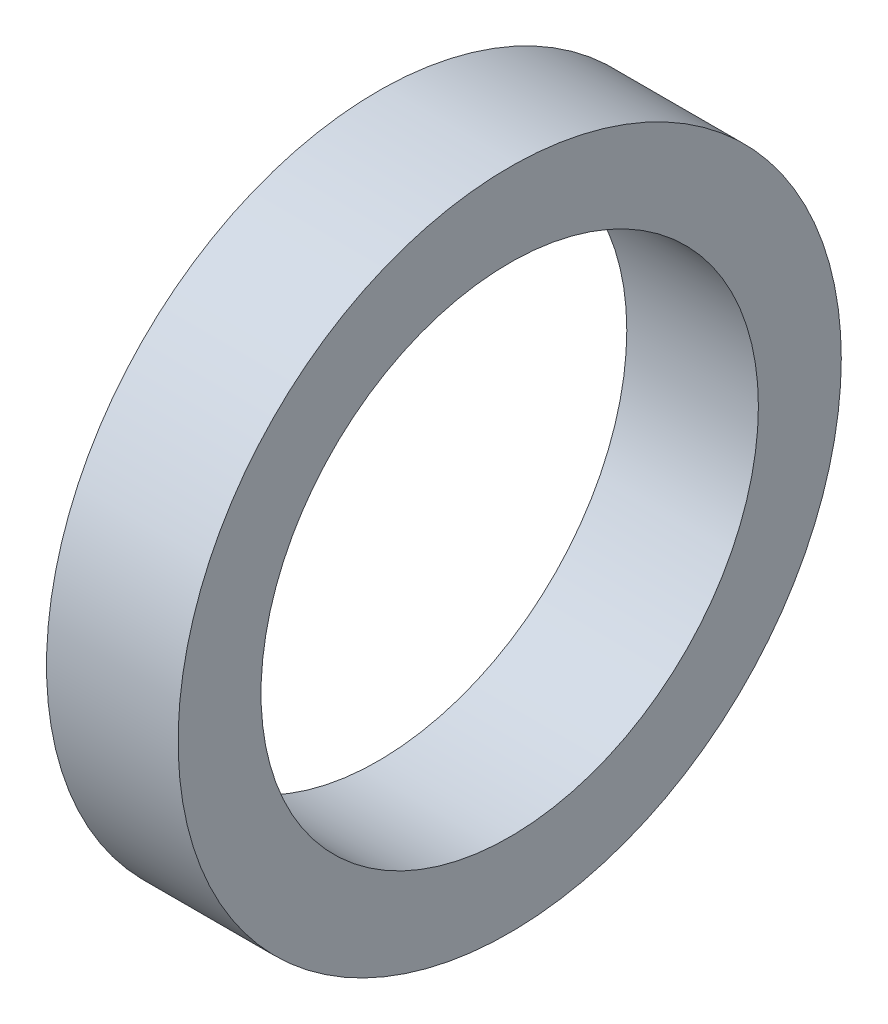
ISO-10303-21;
HEADER;
FILE_DESCRIPTION(('STEP AP214'),'2;1');
FILE_NAME('part.step','',(''),(''),'','','');
FILE_SCHEMA(('AUTOMOTIVE_DESIGN { 1 0 10303 214 1 1 1 1 }'));
ENDSEC;
DATA;
#1=APPLICATION_CONTEXT('core data for automotive mechanical design processes');
#2=APPLICATION_PROTOCOL_DEFINITION('international standard','automotive_design',2000,#1);
#3=PRODUCT_CONTEXT('',#1,'mechanical');
#4=PRODUCT('Part','Part','',(#3));
#5=PRODUCT_RELATED_PRODUCT_CATEGORY('part','',(#4));
#6=PRODUCT_DEFINITION_FORMATION('','',#4);
#7=PRODUCT_DEFINITION_CONTEXT('part definition',#1,'design');
#8=PRODUCT_DEFINITION('design','',#6,#7);
#9=PRODUCT_DEFINITION_SHAPE('','',#8);
#10=(LENGTH_UNIT() NAMED_UNIT(*) SI_UNIT(.MILLI.,.METRE.));
#11=(NAMED_UNIT(*) PLANE_ANGLE_UNIT() SI_UNIT($,.RADIAN.));
#12=(NAMED_UNIT(*) SI_UNIT($,.STERADIAN.) SOLID_ANGLE_UNIT());
#13=UNCERTAINTY_MEASURE_WITH_UNIT(LENGTH_MEASURE(1.E-05),#10,'distance_accuracy_value','');
#14=(GEOMETRIC_REPRESENTATION_CONTEXT(3) GLOBAL_UNCERTAINTY_ASSIGNED_CONTEXT((#13)) GLOBAL_UNIT_ASSIGNED_CONTEXT((#10,
#11,#12)) REPRESENTATION_CONTEXT('',''));
#15=CARTESIAN_POINT('',(0.,0.,0.));
#16=DIRECTION('',(0.,0.,1.));
#17=DIRECTION('',(1.,0.,0.));
#18=AXIS2_PLACEMENT_3D('',#15,#16,#17);
#19=CARTESIAN_POINT('',(0.79375,0.,0.));
#20=DIRECTION('',(1.,0.,0.));
#21=DIRECTION('',(0.,0.,-1.));
#22=AXIS2_PLACEMENT_3D('',#19,#20,#21);
#23=PLANE('',#22);
#24=CARTESIAN_POINT('',(0.79375,0.,0.));
#25=DIRECTION('',(1.,0.,0.));
#26=DIRECTION('',(0.,0.,-1.));
#27=AXIS2_PLACEMENT_3D('',#24,#25,#26);
#28=CIRCLE('',#27,2.);
#29=CARTESIAN_POINT('',(0.79375,0.,-2.));
#30=VERTEX_POINT('',#29);
#31=EDGE_CURVE('E10',#30,#30,#28,.T.);
#32=ORIENTED_EDGE('',*,*,#31,.T.);
#33=EDGE_LOOP('',(#32));
#34=FACE_BOUND('',#33,.T.);
#35=CARTESIAN_POINT('',(0.79375,0.,0.));
#36=DIRECTION('',(1.,0.,0.));
#37=DIRECTION('',(0.,0.,-1.));
#38=AXIS2_PLACEMENT_3D('',#35,#36,#37);
#39=CIRCLE('',#38,1.5);
#40=CARTESIAN_POINT('',(0.79375,0.,-1.5));
#41=VERTEX_POINT('',#40);
#42=EDGE_CURVE('E53',#41,#41,#39,.T.);
#43=ORIENTED_EDGE('',*,*,#42,.F.);
#44=EDGE_LOOP('',(#43));
#45=FACE_BOUND('',#44,.T.);
#46=ADVANCED_FACE('F40',(#34,#45),#23,.T.);
#47=CARTESIAN_POINT('',(0.,0.,0.));
#48=DIRECTION('',(1.,0.,0.));
#49=DIRECTION('',(0.,0.,-1.));
#50=AXIS2_PLACEMENT_3D('',#47,#48,#49);
#51=PLANE('',#50);
#52=CARTESIAN_POINT('',(0.,0.,0.));
#53=DIRECTION('',(1.,0.,0.));
#54=DIRECTION('',(0.,0.,-1.));
#55=AXIS2_PLACEMENT_3D('',#52,#53,#54);
#56=CIRCLE('',#55,2.);
#57=CARTESIAN_POINT('',(0.,0.,-2.));
#58=VERTEX_POINT('',#57);
#59=EDGE_CURVE('E44',#58,#58,#56,.T.);
#60=ORIENTED_EDGE('',*,*,#59,.F.);
#61=EDGE_LOOP('',(#60));
#62=FACE_BOUND('',#61,.T.);
#63=CARTESIAN_POINT('',(0.,0.,0.));
#64=DIRECTION('',(1.,0.,0.));
#65=DIRECTION('',(0.,0.,-1.));
#66=AXIS2_PLACEMENT_3D('',#63,#64,#65);
#67=CIRCLE('',#66,1.5);
#68=CARTESIAN_POINT('',(0.,0.,-1.5));
#69=VERTEX_POINT('',#68);
#70=EDGE_CURVE('E55',#69,#69,#67,.T.);
#71=ORIENTED_EDGE('',*,*,#70,.T.);
#72=EDGE_LOOP('',(#71));
#73=FACE_BOUND('',#72,.T.);
#74=ADVANCED_FACE('F67',(#62,#73),#51,.F.);
#75=CARTESIAN_POINT('',(0.79375,0.,0.));
#76=DIRECTION('',(-1.,0.,0.));
#77=DIRECTION('',(0.,0.,1.));
#78=AXIS2_PLACEMENT_3D('',#75,#76,#77);
#79=CYLINDRICAL_SURFACE('',#78,2.);
#80=ORIENTED_EDGE('',*,*,#31,.F.);
#81=EDGE_LOOP('',(#80));
#82=FACE_BOUND('',#81,.T.);
#83=ORIENTED_EDGE('',*,*,#59,.T.);
#84=EDGE_LOOP('',(#83));
#85=FACE_BOUND('',#84,.T.);
#86=ADVANCED_FACE('F42',(#82,#85),#79,.T.);
#87=CARTESIAN_POINT('',(0.79375,0.,0.));
#88=DIRECTION('',(-1.,0.,0.));
#89=DIRECTION('',(0.,0.,1.));
#90=AXIS2_PLACEMENT_3D('',#87,#88,#89);
#91=CYLINDRICAL_SURFACE('',#90,1.5);
#92=ORIENTED_EDGE('',*,*,#42,.T.);
#93=EDGE_LOOP('',(#92));
#94=FACE_BOUND('',#93,.T.);
#95=ORIENTED_EDGE('',*,*,#70,.F.);
#96=EDGE_LOOP('',(#95));
#97=FACE_BOUND('',#96,.T.);
#98=ADVANCED_FACE('F63',(#94,#97),#91,.F.);
#99=CLOSED_SHELL('',(#46,#74,#86,#98));
#100=MANIFOLD_SOLID_BREP('B2',#99);
#101=ADVANCED_BREP_SHAPE_REPRESENTATION('',(#18,#100),#14);
#102=SHAPE_DEFINITION_REPRESENTATION(#9,#101);
ENDSEC;
END-ISO-10303-21;
